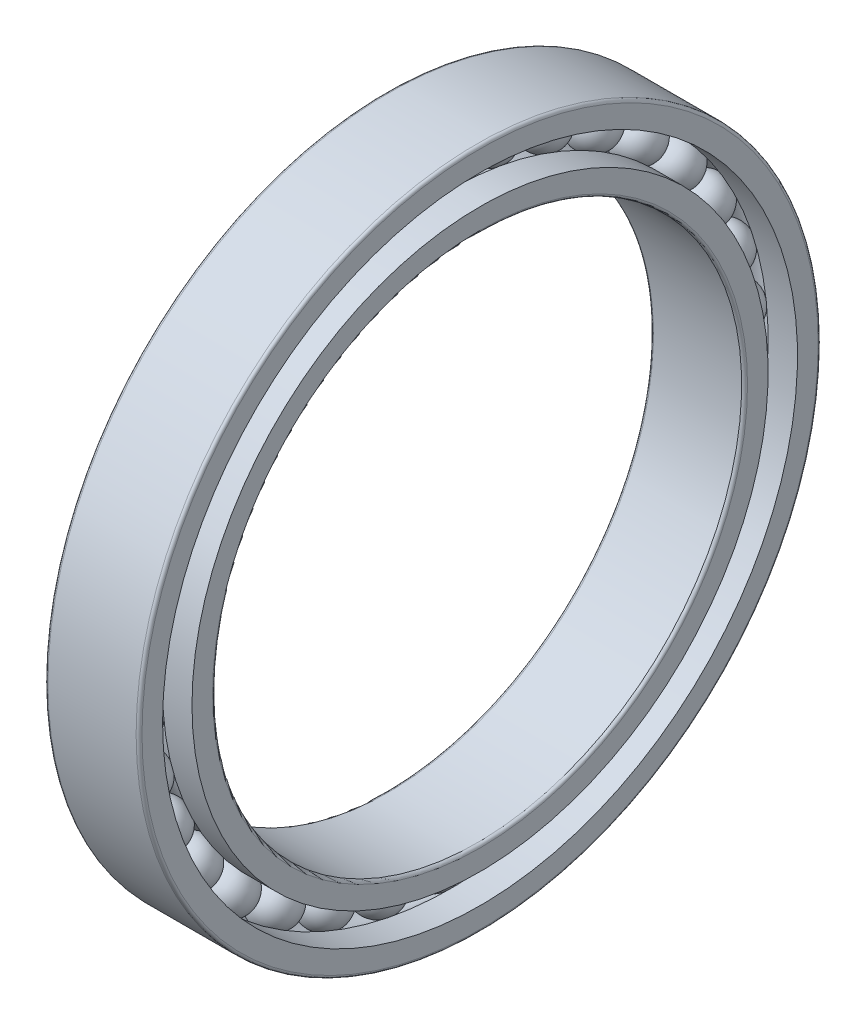
ISO-10303-21;
HEADER;
FILE_DESCRIPTION(('STEP AP214'),'2;1');
FILE_NAME('part.step','',(''),(''),'','','');
FILE_SCHEMA(('AUTOMOTIVE_DESIGN { 1 0 10303 214 1 1 1 1 }'));
ENDSEC;
DATA;
#1=APPLICATION_CONTEXT('core data for automotive mechanical design processes');
#2=APPLICATION_PROTOCOL_DEFINITION('international standard','automotive_design',2000,#1);
#3=PRODUCT_CONTEXT('',#1,'mechanical');
#4=PRODUCT('Part','Part','',(#3));
#5=PRODUCT_RELATED_PRODUCT_CATEGORY('part','',(#4));
#6=PRODUCT_DEFINITION_FORMATION('','',#4);
#7=PRODUCT_DEFINITION_CONTEXT('part definition',#1,'design');
#8=PRODUCT_DEFINITION('design','',#6,#7);
#9=PRODUCT_DEFINITION_SHAPE('','',#8);
#10=(LENGTH_UNIT() NAMED_UNIT(*) SI_UNIT(.MILLI.,.METRE.));
#11=(NAMED_UNIT(*) PLANE_ANGLE_UNIT() SI_UNIT($,.RADIAN.));
#12=(NAMED_UNIT(*) SI_UNIT($,.STERADIAN.) SOLID_ANGLE_UNIT());
#13=UNCERTAINTY_MEASURE_WITH_UNIT(LENGTH_MEASURE(1.E-05),#10,'distance_accuracy_value','');
#14=(GEOMETRIC_REPRESENTATION_CONTEXT(3) GLOBAL_UNCERTAINTY_ASSIGNED_CONTEXT((#13)) GLOBAL_UNIT_ASSIGNED_CONTEXT((#10,
#11,#12)) REPRESENTATION_CONTEXT('',''));
#15=CARTESIAN_POINT('',(0.,0.,0.));
#16=DIRECTION('',(0.,0.,1.));
#17=DIRECTION('',(1.,0.,0.));
#18=AXIS2_PLACEMENT_3D('',#15,#16,#17);
#19=CARTESIAN_POINT('',(0.,25.3115573168605,4.73155008377634));
#20=DIRECTION('',(-1.,0.,0.));
#21=DIRECTION('',(0.,0.982973099683904,0.183749517816557));
#22=AXIS2_PLACEMENT_3D('',#19,#20,#21);
#23=SPHERICAL_SURFACE('',#22,1.95);
#24=CARTESIAN_POINT('',(-1.95,25.3115573168605,4.73155008377634));
#25=VERTEX_POINT('',#24);
#26=VERTEX_LOOP('',#25);
#27=FACE_BOUND('',#26,.T.);
#28=ADVANCED_FACE('F47',(#27),#23,.T.);
#29=CLOSED_SHELL('',(#28));
#30=MANIFOLD_SOLID_BREP('B2',#29);
#31=CARTESIAN_POINT('',(0.,24.0111599071623,9.30197290431887));
#32=DIRECTION('',(-1.,0.,0.));
#33=DIRECTION('',(0.,0.932472229404361,0.361241666187141));
#34=AXIS2_PLACEMENT_3D('',#31,#32,#33);
#35=SPHERICAL_SURFACE('',#34,1.95);
#36=CARTESIAN_POINT('',(-1.95,24.0111599071623,9.30197290431887));
#37=VERTEX_POINT('',#36);
#38=VERTEX_LOOP('',#37);
#39=FACE_BOUND('',#38,.T.);
#40=ADVANCED_FACE('F67',(#39),#35,.T.);
#41=CLOSED_SHELL('',(#40));
#42=MANIFOLD_SOLID_BREP('B6',#41);
#43=CARTESIAN_POINT('',(0.,21.8930912450377,13.5556281940916));
#44=DIRECTION('',(-1.,0.,0.));
#45=DIRECTION('',(0.,0.850217135729621,0.526432162877345));
#46=AXIS2_PLACEMENT_3D('',#43,#44,#45);
#47=SPHERICAL_SURFACE('',#46,1.95);
#48=CARTESIAN_POINT('',(-1.95,21.8930912450377,13.5556281940916));
#49=VERTEX_POINT('',#48);
#50=VERTEX_LOOP('',#49);
#51=FACE_BOUND('',#50,.T.);
#52=ADVANCED_FACE('F87',(#51),#47,.T.);
#53=CLOSED_SHELL('',(#52));
#54=MANIFOLD_SOLID_BREP('B43',#53);
#55=CARTESIAN_POINT('',(0.,19.0294796184322,17.3476628238986));
#56=DIRECTION('',(-1.,0.,0.));
#57=DIRECTION('',(0.,0.739008917220668,0.673695643646548));
#58=AXIS2_PLACEMENT_3D('',#55,#56,#57);
#59=SPHERICAL_SURFACE('',#58,1.95);
#60=CARTESIAN_POINT('',(-1.95,19.0294796184322,17.3476628238986));
#61=VERTEX_POINT('',#60);
#62=VERTEX_LOOP('',#61);
#63=FACE_BOUND('',#62,.T.);
#64=ADVANCED_FACE('F107',(#63),#59,.T.);
#65=CLOSED_SHELL('',(#64));
#66=MANIFOLD_SOLID_BREP('B63',#65);
#67=CARTESIAN_POINT('',(0.,15.5178418867661,20.548943602466));
#68=DIRECTION('',(-1.,0.,0.));
#69=DIRECTION('',(0.,0.602634636379266,0.798017227280232));
#70=AXIS2_PLACEMENT_3D('',#67,#68,#69);
#71=SPHERICAL_SURFACE('',#70,1.95);
#72=CARTESIAN_POINT('',(-1.95,15.5178418867661,20.548943602466));
#73=VERTEX_POINT('',#72);
#74=VERTEX_LOOP('',#73);
#75=FACE_BOUND('',#74,.T.);
#76=ADVANCED_FACE('F127',(#75),#71,.T.);
#77=CLOSED_SHELL('',(#76));
#78=MANIFOLD_SOLID_BREP('B83',#77);
#79=CARTESIAN_POINT('',(0.,11.4777626612461,23.0504547523927));
#80=DIRECTION('',(-1.,0.,0.));
#81=DIRECTION('',(0.,0.445738355776549,0.895163291355057));
#82=AXIS2_PLACEMENT_3D('',#79,#80,#81);
#83=SPHERICAL_SURFACE('',#82,1.95);
#84=CARTESIAN_POINT('',(-1.95,11.4777626612461,23.0504547523927));
#85=VERTEX_POINT('',#84);
#86=VERTEX_LOOP('',#85);
#87=FACE_BOUND('',#86,.T.);
#88=ADVANCED_FACE('F147',(#87),#83,.T.);
#89=CLOSED_SHELL('',(#88));
#90=MANIFOLD_SOLID_BREP('B103',#89);
#91=CARTESIAN_POINT('',(0.,7.04682199435642,24.7670103117));
#92=DIRECTION('',(-1.,0.,0.));
#93=DIRECTION('',(0.,0.273662990072094,0.961825643172816));
#94=AXIS2_PLACEMENT_3D('',#91,#92,#93);
#95=SPHERICAL_SURFACE('',#94,1.95);
#96=CARTESIAN_POINT('',(-1.95,7.04682199435642,24.7670103117));
#97=VERTEX_POINT('',#96);
#98=VERTEX_LOOP('',#97);
#99=FACE_BOUND('',#98,.T.);
#100=ADVANCED_FACE('F167',(#99),#95,.T.);
#101=CLOSED_SHELL('',(#100));
#102=MANIFOLD_SOLID_BREP('B123',#101);
#103=CARTESIAN_POINT('',(0.,2.37591025618031,25.6401550395971));
#104=DIRECTION('',(-1.,0.,0.));
#105=DIRECTION('',(0.,0.092268359463313,0.995734176295033));
#106=AXIS2_PLACEMENT_3D('',#103,#104,#105);
#107=SPHERICAL_SURFACE('',#106,1.95);
#108=CARTESIAN_POINT('',(-1.95,2.37591025618031,25.6401550395971));
#109=VERTEX_POINT('',#108);
#110=VERTEX_LOOP('',#109);
#111=FACE_BOUND('',#110,.T.);
#112=ADVANCED_FACE('F187',(#111),#107,.T.);
#113=CLOSED_SHELL('',(#112));
#114=MANIFOLD_SOLID_BREP('B143',#113);
#115=CARTESIAN_POINT('',(0.,-2.37591025617975,25.6401550395972));
#116=DIRECTION('',(-1.,0.,0.));
#117=DIRECTION('',(0.,-0.0922683594632913,0.995734176295036));
#118=AXIS2_PLACEMENT_3D('',#115,#116,#117);
#119=SPHERICAL_SURFACE('',#118,1.95);
#120=CARTESIAN_POINT('',(-1.95,-2.37591025617975,25.6401550395972));
#121=VERTEX_POINT('',#120);
#122=VERTEX_LOOP('',#121);
#123=FACE_BOUND('',#122,.T.);
#124=ADVANCED_FACE('F207',(#123),#119,.T.);
#125=CLOSED_SHELL('',(#124));
#126=MANIFOLD_SOLID_BREP('B163',#125);
#127=CARTESIAN_POINT('',(0.,-7.04682199435588,24.7670103117002));
#128=DIRECTION('',(-1.,0.,0.));
#129=DIRECTION('',(0.,-0.273662990072073,0.961825643172822));
#130=AXIS2_PLACEMENT_3D('',#127,#128,#129);
#131=SPHERICAL_SURFACE('',#130,1.95);
#132=CARTESIAN_POINT('',(-1.95,-7.04682199435588,24.7670103117002));
#133=VERTEX_POINT('',#132);
#134=VERTEX_LOOP('',#133);
#135=FACE_BOUND('',#134,.T.);
#136=ADVANCED_FACE('F227',(#135),#131,.T.);
#137=CLOSED_SHELL('',(#136));
#138=MANIFOLD_SOLID_BREP('B183',#137);
#139=CARTESIAN_POINT('',(0.,-11.4777626612456,23.050454752393));
#140=DIRECTION('',(-1.,0.,0.));
#141=DIRECTION('',(0.,-0.44573835577653,0.895163291355066));
#142=AXIS2_PLACEMENT_3D('',#139,#140,#141);
#143=SPHERICAL_SURFACE('',#142,1.95);
#144=CARTESIAN_POINT('',(-1.95,-11.4777626612456,23.050454752393));
#145=VERTEX_POINT('',#144);
#146=VERTEX_LOOP('',#145);
#147=FACE_BOUND('',#146,.T.);
#148=ADVANCED_FACE('F247',(#147),#143,.T.);
#149=CLOSED_SHELL('',(#148));
#150=MANIFOLD_SOLID_BREP('B203',#149);
#151=CARTESIAN_POINT('',(0.,-15.5178418867657,20.5489436024663));
#152=DIRECTION('',(-1.,0.,0.));
#153=DIRECTION('',(0.,-0.602634636379249,0.798017227280245));
#154=AXIS2_PLACEMENT_3D('',#151,#152,#153);
#155=SPHERICAL_SURFACE('',#154,1.95);
#156=CARTESIAN_POINT('',(-1.95,-15.5178418867657,20.5489436024663));
#157=VERTEX_POINT('',#156);
#158=VERTEX_LOOP('',#157);
#159=FACE_BOUND('',#158,.T.);
#160=ADVANCED_FACE('F267',(#159),#155,.T.);
#161=CLOSED_SHELL('',(#160));
#162=MANIFOLD_SOLID_BREP('B223',#161);
#163=CARTESIAN_POINT('',(0.,-19.0294796184318,17.347662823899));
#164=DIRECTION('',(-1.,0.,0.));
#165=DIRECTION('',(0.,-0.739008917220653,0.673695643646564));
#166=AXIS2_PLACEMENT_3D('',#163,#164,#165);
#167=SPHERICAL_SURFACE('',#166,1.95);
#168=CARTESIAN_POINT('',(-1.95,-19.0294796184318,17.347662823899));
#169=VERTEX_POINT('',#168);
#170=VERTEX_LOOP('',#169);
#171=FACE_BOUND('',#170,.T.);
#172=ADVANCED_FACE('F287',(#171),#167,.T.);
#173=CLOSED_SHELL('',(#172));
#174=MANIFOLD_SOLID_BREP('B243',#173);
#175=CARTESIAN_POINT('',(0.,-21.8930912450375,13.5556281940921));
#176=DIRECTION('',(-1.,0.,0.));
#177=DIRECTION('',(0.,-0.85021713572961,0.526432162877363));
#178=AXIS2_PLACEMENT_3D('',#175,#176,#177);
#179=SPHERICAL_SURFACE('',#178,1.95);
#180=CARTESIAN_POINT('',(-1.95,-21.8930912450375,13.5556281940921));
#181=VERTEX_POINT('',#180);
#182=VERTEX_LOOP('',#181);
#183=FACE_BOUND('',#182,.T.);
#184=ADVANCED_FACE('F307',(#183),#179,.T.);
#185=CLOSED_SHELL('',(#184));
#186=MANIFOLD_SOLID_BREP('B263',#185);
#187=CARTESIAN_POINT('',(0.,-24.0111599071621,9.30197290431937));
#188=DIRECTION('',(-1.,0.,0.));
#189=DIRECTION('',(0.,-0.932472229404353,0.36124166618716));
#190=AXIS2_PLACEMENT_3D('',#187,#188,#189);
#191=SPHERICAL_SURFACE('',#190,1.95);
#192=CARTESIAN_POINT('',(-1.95,-24.0111599071621,9.30197290431937));
#193=VERTEX_POINT('',#192);
#194=VERTEX_LOOP('',#193);
#195=FACE_BOUND('',#194,.T.);
#196=ADVANCED_FACE('F327',(#195),#191,.T.);
#197=CLOSED_SHELL('',(#196));
#198=MANIFOLD_SOLID_BREP('B283',#197);
#199=CARTESIAN_POINT('',(0.,-25.3115573168604,4.73155008377687));
#200=DIRECTION('',(-1.,0.,0.));
#201=DIRECTION('',(0.,-0.9829730996839,0.183749517816578));
#202=AXIS2_PLACEMENT_3D('',#199,#200,#201);
#203=SPHERICAL_SURFACE('',#202,1.95);
#204=CARTESIAN_POINT('',(-1.95,-25.3115573168604,4.73155008377687));
#205=VERTEX_POINT('',#204);
#206=VERTEX_LOOP('',#205);
#207=FACE_BOUND('',#206,.T.);
#208=ADVANCED_FACE('F347',(#207),#203,.T.);
#209=CLOSED_SHELL('',(#208));
#210=MANIFOLD_SOLID_BREP('B303',#209);
#211=CARTESIAN_POINT('',(0.,-25.75,0.));
#212=DIRECTION('',(-1.,0.,0.));
#213=DIRECTION('',(0.,-1.,0.));
#214=AXIS2_PLACEMENT_3D('',#211,#212,#213);
#215=SPHERICAL_SURFACE('',#214,1.95);
#216=CARTESIAN_POINT('',(-1.95,-25.75,0.));
#217=VERTEX_POINT('',#216);
#218=VERTEX_LOOP('',#217);
#219=FACE_BOUND('',#218,.T.);
#220=ADVANCED_FACE('F367',(#219),#215,.T.);
#221=CLOSED_SHELL('',(#220));
#222=MANIFOLD_SOLID_BREP('B323',#221);
#223=CARTESIAN_POINT('',(0.,-25.3115573168605,-4.73155008377652));
#224=DIRECTION('',(-1.,0.,0.));
#225=DIRECTION('',(0.,-0.982973099683903,-0.183749517816564));
#226=AXIS2_PLACEMENT_3D('',#223,#224,#225);
#227=SPHERICAL_SURFACE('',#226,1.95);
#228=CARTESIAN_POINT('',(-1.95,-25.3115573168605,-4.73155008377652));
#229=VERTEX_POINT('',#228);
#230=VERTEX_LOOP('',#229);
#231=FACE_BOUND('',#230,.T.);
#232=ADVANCED_FACE('F387',(#231),#227,.T.);
#233=CLOSED_SHELL('',(#232));
#234=MANIFOLD_SOLID_BREP('B343',#233);
#235=CARTESIAN_POINT('',(0.,-24.0111599071622,-9.30197290431904));
#236=DIRECTION('',(-1.,0.,0.));
#237=DIRECTION('',(0.,-0.932472229404358,-0.361241666187147));
#238=AXIS2_PLACEMENT_3D('',#235,#236,#237);
#239=SPHERICAL_SURFACE('',#238,1.95);
#240=CARTESIAN_POINT('',(-1.95,-24.0111599071622,-9.30197290431904));
#241=VERTEX_POINT('',#240);
#242=VERTEX_LOOP('',#241);
#243=FACE_BOUND('',#242,.T.);
#244=ADVANCED_FACE('F407',(#243),#239,.T.);
#245=CLOSED_SHELL('',(#244));
#246=MANIFOLD_SOLID_BREP('B363',#245);
#247=CARTESIAN_POINT('',(0.,-21.8930912450376,-13.5556281940918));
#248=DIRECTION('',(-1.,0.,0.));
#249=DIRECTION('',(0.,-0.850217135729617,-0.526432162877351));
#250=AXIS2_PLACEMENT_3D('',#247,#248,#249);
#251=SPHERICAL_SURFACE('',#250,1.95);
#252=CARTESIAN_POINT('',(-1.95,-21.8930912450376,-13.5556281940918));
#253=VERTEX_POINT('',#252);
#254=VERTEX_LOOP('',#253);
#255=FACE_BOUND('',#254,.T.);
#256=ADVANCED_FACE('F427',(#255),#251,.T.);
#257=CLOSED_SHELL('',(#256));
#258=MANIFOLD_SOLID_BREP('B383',#257);
#259=CARTESIAN_POINT('',(0.,-19.0294796184321,-17.3476628238987));
#260=DIRECTION('',(-1.,0.,0.));
#261=DIRECTION('',(0.,-0.739008917220663,-0.673695643646553));
#262=AXIS2_PLACEMENT_3D('',#259,#260,#261);
#263=SPHERICAL_SURFACE('',#262,1.95);
#264=CARTESIAN_POINT('',(-1.95,-19.0294796184321,-17.3476628238987));
#265=VERTEX_POINT('',#264);
#266=VERTEX_LOOP('',#265);
#267=FACE_BOUND('',#266,.T.);
#268=ADVANCED_FACE('F447',(#267),#263,.T.);
#269=CLOSED_SHELL('',(#268));
#270=MANIFOLD_SOLID_BREP('B403',#269);
#271=CARTESIAN_POINT('',(0.,-15.517841886766,-20.5489436024661));
#272=DIRECTION('',(-1.,0.,0.));
#273=DIRECTION('',(0.,-0.602634636379261,-0.798017227280236));
#274=AXIS2_PLACEMENT_3D('',#271,#272,#273);
#275=SPHERICAL_SURFACE('',#274,1.95);
#276=CARTESIAN_POINT('',(-1.95,-15.517841886766,-20.5489436024661));
#277=VERTEX_POINT('',#276);
#278=VERTEX_LOOP('',#277);
#279=FACE_BOUND('',#278,.T.);
#280=ADVANCED_FACE('F467',(#279),#275,.T.);
#281=CLOSED_SHELL('',(#280));
#282=MANIFOLD_SOLID_BREP('B423',#281);
#283=CARTESIAN_POINT('',(0.,-11.477762661246,-23.0504547523928));
#284=DIRECTION('',(-1.,0.,0.));
#285=DIRECTION('',(0.,-0.445738355776542,-0.895163291355061));
#286=AXIS2_PLACEMENT_3D('',#283,#284,#285);
#287=SPHERICAL_SURFACE('',#286,1.95);
#288=CARTESIAN_POINT('',(-1.95,-11.477762661246,-23.0504547523928));
#289=VERTEX_POINT('',#288);
#290=VERTEX_LOOP('',#289);
#291=FACE_BOUND('',#290,.T.);
#292=ADVANCED_FACE('F487',(#291),#287,.T.);
#293=CLOSED_SHELL('',(#292));
#294=MANIFOLD_SOLID_BREP('B443',#293);
#295=CARTESIAN_POINT('',(0.,-7.04682199435623,-24.7670103117001));
#296=DIRECTION('',(-1.,0.,0.));
#297=DIRECTION('',(0.,-0.273662990072087,-0.961825643172818));
#298=AXIS2_PLACEMENT_3D('',#295,#296,#297);
#299=SPHERICAL_SURFACE('',#298,1.95);
#300=CARTESIAN_POINT('',(-1.95,-7.04682199435623,-24.7670103117001));
#301=VERTEX_POINT('',#300);
#302=VERTEX_LOOP('',#301);
#303=FACE_BOUND('',#302,.T.);
#304=ADVANCED_FACE('F507',(#303),#299,.T.);
#305=CLOSED_SHELL('',(#304));
#306=MANIFOLD_SOLID_BREP('B463',#305);
#307=CARTESIAN_POINT('',(0.,-2.37591025618012,-25.6401550395971));
#308=DIRECTION('',(-1.,0.,0.));
#309=DIRECTION('',(0.,-0.0922683594633057,-0.995734176295034));
#310=AXIS2_PLACEMENT_3D('',#307,#308,#309);
#311=SPHERICAL_SURFACE('',#310,1.95);
#312=CARTESIAN_POINT('',(-1.95,-2.37591025618012,-25.6401550395971));
#313=VERTEX_POINT('',#312);
#314=VERTEX_LOOP('',#313);
#315=FACE_BOUND('',#314,.T.);
#316=ADVANCED_FACE('F527',(#315),#311,.T.);
#317=CLOSED_SHELL('',(#316));
#318=MANIFOLD_SOLID_BREP('B483',#317);
#319=CARTESIAN_POINT('',(0.,2.37591025617994,-25.6401550395972));
#320=DIRECTION('',(-1.,0.,0.));
#321=DIRECTION('',(0.,0.0922683594632987,-0.995734176295035));
#322=AXIS2_PLACEMENT_3D('',#319,#320,#321);
#323=SPHERICAL_SURFACE('',#322,1.95);
#324=CARTESIAN_POINT('',(-1.95,2.37591025617994,-25.6401550395972));
#325=VERTEX_POINT('',#324);
#326=VERTEX_LOOP('',#325);
#327=FACE_BOUND('',#326,.T.);
#328=ADVANCED_FACE('F547',(#327),#323,.T.);
#329=CLOSED_SHELL('',(#328));
#330=MANIFOLD_SOLID_BREP('B503',#329);
#331=CARTESIAN_POINT('',(0.,7.04682199435606,-24.7670103117001));
#332=DIRECTION('',(-1.,0.,0.));
#333=DIRECTION('',(0.,0.27366299007208,-0.96182564317282));
#334=AXIS2_PLACEMENT_3D('',#331,#332,#333);
#335=SPHERICAL_SURFACE('',#334,1.95);
#336=CARTESIAN_POINT('',(-1.95,7.04682199435606,-24.7670103117001));
#337=VERTEX_POINT('',#336);
#338=VERTEX_LOOP('',#337);
#339=FACE_BOUND('',#338,.T.);
#340=ADVANCED_FACE('F567',(#339),#335,.T.);
#341=CLOSED_SHELL('',(#340));
#342=MANIFOLD_SOLID_BREP('B523',#341);
#343=CARTESIAN_POINT('',(0.,11.4777626612458,-23.0504547523929));
#344=DIRECTION('',(-1.,0.,0.));
#345=DIRECTION('',(0.,0.445738355776536,-0.895163291355063));
#346=AXIS2_PLACEMENT_3D('',#343,#344,#345);
#347=SPHERICAL_SURFACE('',#346,1.95);
#348=CARTESIAN_POINT('',(-1.95,11.4777626612458,-23.0504547523929));
#349=VERTEX_POINT('',#348);
#350=VERTEX_LOOP('',#349);
#351=FACE_BOUND('',#350,.T.);
#352=ADVANCED_FACE('F587',(#351),#347,.T.);
#353=CLOSED_SHELL('',(#352));
#354=MANIFOLD_SOLID_BREP('B543',#353);
#355=CARTESIAN_POINT('',(0.,15.5178418867658,-20.5489436024662));
#356=DIRECTION('',(-1.,0.,0.));
#357=DIRECTION('',(0.,0.602634636379255,-0.798017227280241));
#358=AXIS2_PLACEMENT_3D('',#355,#356,#357);
#359=SPHERICAL_SURFACE('',#358,1.95);
#360=CARTESIAN_POINT('',(-1.95,15.5178418867658,-20.5489436024662));
#361=VERTEX_POINT('',#360);
#362=VERTEX_LOOP('',#361);
#363=FACE_BOUND('',#362,.T.);
#364=ADVANCED_FACE('F607',(#363),#359,.T.);
#365=CLOSED_SHELL('',(#364));
#366=MANIFOLD_SOLID_BREP('B563',#365);
#367=CARTESIAN_POINT('',(0.,19.0294796184319,-17.3476628238989));
#368=DIRECTION('',(-1.,0.,0.));
#369=DIRECTION('',(0.,0.739008917220658,-0.673695643646558));
#370=AXIS2_PLACEMENT_3D('',#367,#368,#369);
#371=SPHERICAL_SURFACE('',#370,1.95);
#372=CARTESIAN_POINT('',(-1.95,19.0294796184319,-17.3476628238989));
#373=VERTEX_POINT('',#372);
#374=VERTEX_LOOP('',#373);
#375=FACE_BOUND('',#374,.T.);
#376=ADVANCED_FACE('F627',(#375),#371,.T.);
#377=CLOSED_SHELL('',(#376));
#378=MANIFOLD_SOLID_BREP('B583',#377);
#379=CARTESIAN_POINT('',(0.,21.8930912450375,-13.5556281940919));
#380=DIRECTION('',(-1.,0.,0.));
#381=DIRECTION('',(0.,0.850217135729613,-0.526432162877357));
#382=AXIS2_PLACEMENT_3D('',#379,#380,#381);
#383=SPHERICAL_SURFACE('',#382,1.95);
#384=CARTESIAN_POINT('',(-1.95,21.8930912450375,-13.5556281940919));
#385=VERTEX_POINT('',#384);
#386=VERTEX_LOOP('',#385);
#387=FACE_BOUND('',#386,.T.);
#388=ADVANCED_FACE('F647',(#387),#383,.T.);
#389=CLOSED_SHELL('',(#388));
#390=MANIFOLD_SOLID_BREP('B603',#389);
#391=CARTESIAN_POINT('',(0.,24.0111599071622,-9.30197290431921));
#392=DIRECTION('',(-1.,0.,0.));
#393=DIRECTION('',(0.,0.932472229404355,-0.361241666187154));
#394=AXIS2_PLACEMENT_3D('',#391,#392,#393);
#395=SPHERICAL_SURFACE('',#394,1.95);
#396=CARTESIAN_POINT('',(-1.95,24.0111599071622,-9.30197290431921));
#397=VERTEX_POINT('',#396);
#398=VERTEX_LOOP('',#397);
#399=FACE_BOUND('',#398,.T.);
#400=ADVANCED_FACE('F667',(#399),#395,.T.);
#401=CLOSED_SHELL('',(#400));
#402=MANIFOLD_SOLID_BREP('B623',#401);
#403=CARTESIAN_POINT('',(0.,25.3115573168605,-4.7315500837767));
#404=DIRECTION('',(-1.,0.,0.));
#405=DIRECTION('',(0.,0.982973099683902,-0.183749517816571));
#406=AXIS2_PLACEMENT_3D('',#403,#404,#405);
#407=SPHERICAL_SURFACE('',#406,1.95);
#408=CARTESIAN_POINT('',(-1.95,25.3115573168605,-4.7315500837767));
#409=VERTEX_POINT('',#408);
#410=VERTEX_LOOP('',#409);
#411=FACE_BOUND('',#410,.T.);
#412=ADVANCED_FACE('F687',(#411),#407,.T.);
#413=CLOSED_SHELL('',(#412));
#414=MANIFOLD_SOLID_BREP('B643',#413);
#415=CARTESIAN_POINT('',(0.,25.75,0.));
#416=DIRECTION('',(-1.,0.,0.));
#417=DIRECTION('',(0.,1.,0.));
#418=AXIS2_PLACEMENT_3D('',#415,#416,#417);
#419=SPHERICAL_SURFACE('',#418,1.95);
#420=CARTESIAN_POINT('',(-1.95,25.75,0.));
#421=VERTEX_POINT('',#420);
#422=VERTEX_LOOP('',#421);
#423=FACE_BOUND('',#422,.T.);
#424=ADVANCED_FACE('F709',(#423),#419,.T.);
#425=CLOSED_SHELL('',(#424));
#426=MANIFOLD_SOLID_BREP('B663',#425);
#427=CARTESIAN_POINT('',(-3.75,0.,0.));
#428=DIRECTION('',(-1.,0.,0.));
#429=DIRECTION('',(0.,0.,1.));
#430=AXIS2_PLACEMENT_3D('',#427,#428,#429);
#431=TOROIDAL_SURFACE('',#430,22.75,0.25);
#432=CARTESIAN_POINT('',(-3.75,0.,0.));
#433=DIRECTION('',(-1.,0.,0.));
#434=DIRECTION('',(0.,0.,1.));
#435=AXIS2_PLACEMENT_3D('',#432,#433,#434);
#436=CIRCLE('',#435,22.5);
#437=CARTESIAN_POINT('',(-3.75,0.,22.5));
#438=VERTEX_POINT('',#437);
#439=EDGE_CURVE('E758',#438,#438,#436,.T.);
#440=ORIENTED_EDGE('',*,*,#439,.F.);
#441=EDGE_LOOP('',(#440));
#442=FACE_BOUND('',#441,.T.);
#443=CARTESIAN_POINT('',(-4.,0.,0.));
#444=DIRECTION('',(-1.,0.,0.));
#445=DIRECTION('',(0.,0.,1.));
#446=AXIS2_PLACEMENT_3D('',#443,#444,#445);
#447=CIRCLE('',#446,22.75);
#448=CARTESIAN_POINT('',(-4.,0.,22.75));
#449=VERTEX_POINT('',#448);
#450=EDGE_CURVE('E708',#449,#449,#447,.T.);
#451=ORIENTED_EDGE('',*,*,#450,.T.);
#452=EDGE_LOOP('',(#451));
#453=FACE_BOUND('',#452,.T.);
#454=ADVANCED_FACE('F730',(#442,#453),#431,.T.);
#455=CARTESIAN_POINT('',(-4.,22.75,0.));
#456=DIRECTION('',(1.,0.,0.));
#457=DIRECTION('',(0.,0.,-1.));
#458=AXIS2_PLACEMENT_3D('',#455,#456,#457);
#459=PLANE('',#458);
#460=ORIENTED_EDGE('',*,*,#450,.F.);
#461=EDGE_LOOP('',(#460));
#462=FACE_BOUND('',#461,.T.);
#463=CARTESIAN_POINT('',(-4.,0.,0.));
#464=DIRECTION('',(-1.,0.,0.));
#465=DIRECTION('',(0.,0.,1.));
#466=AXIS2_PLACEMENT_3D('',#463,#464,#465);
#467=CIRCLE('',#466,24.5);
#468=CARTESIAN_POINT('',(-4.,0.,24.5));
#469=VERTEX_POINT('',#468);
#470=EDGE_CURVE('E736',#469,#469,#467,.T.);
#471=ORIENTED_EDGE('',*,*,#470,.T.);
#472=EDGE_LOOP('',(#471));
#473=FACE_BOUND('',#472,.T.);
#474=ADVANCED_FACE('F765',(#462,#473),#459,.F.);
#475=CARTESIAN_POINT('',(0.,0.,0.));
#476=DIRECTION('',(-1.,0.,0.));
#477=DIRECTION('',(0.,0.,1.));
#478=AXIS2_PLACEMENT_3D('',#475,#476,#477);
#479=CYLINDRICAL_SURFACE('',#478,24.5);
#480=ORIENTED_EDGE('',*,*,#470,.F.);
#481=EDGE_LOOP('',(#480));
#482=FACE_BOUND('',#481,.T.);
#483=CARTESIAN_POINT('',(-1.49666295470957,0.,0.));
#484=DIRECTION('',(-1.,0.,0.));
#485=DIRECTION('',(0.,0.,1.));
#486=AXIS2_PLACEMENT_3D('',#483,#484,#485);
#487=CIRCLE('',#486,24.5);
#488=CARTESIAN_POINT('',(-1.49666295470957,0.,24.5));
#489=VERTEX_POINT('',#488);
#490=EDGE_CURVE('E740',#489,#489,#487,.T.);
#491=ORIENTED_EDGE('',*,*,#490,.T.);
#492=EDGE_LOOP('',(#491));
#493=FACE_BOUND('',#492,.T.);
#494=ADVANCED_FACE('F769',(#482,#493),#479,.T.);
#495=CARTESIAN_POINT('',(0.,0.,0.));
#496=DIRECTION('',(-1.,0.,0.));
#497=DIRECTION('',(0.,0.,1.));
#498=AXIS2_PLACEMENT_3D('',#495,#496,#497);
#499=TOROIDAL_SURFACE('',#498,25.75,1.95);
#500=ORIENTED_EDGE('',*,*,#490,.F.);
#501=EDGE_LOOP('',(#500));
#502=FACE_BOUND('',#501,.T.);
#503=CARTESIAN_POINT('',(1.49666295470957,0.,0.));
#504=DIRECTION('',(-1.,0.,0.));
#505=DIRECTION('',(0.,0.,1.));
#506=AXIS2_PLACEMENT_3D('',#503,#504,#505);
#507=CIRCLE('',#506,24.5);
#508=CARTESIAN_POINT('',(1.49666295470957,0.,24.5));
#509=VERTEX_POINT('',#508);
#510=EDGE_CURVE('E744',#509,#509,#507,.T.);
#511=ORIENTED_EDGE('',*,*,#510,.T.);
#512=EDGE_LOOP('',(#511));
#513=FACE_BOUND('',#512,.T.);
#514=ADVANCED_FACE('F775',(#502,#513),#499,.F.);
#515=CARTESIAN_POINT('',(0.,0.,0.));
#516=DIRECTION('',(-1.,0.,0.));
#517=DIRECTION('',(0.,0.,1.));
#518=AXIS2_PLACEMENT_3D('',#515,#516,#517);
#519=CYLINDRICAL_SURFACE('',#518,24.5);
#520=ORIENTED_EDGE('',*,*,#510,.F.);
#521=EDGE_LOOP('',(#520));
#522=FACE_BOUND('',#521,.T.);
#523=CARTESIAN_POINT('',(4.,0.,0.));
#524=DIRECTION('',(-1.,0.,0.));
#525=DIRECTION('',(0.,0.,1.));
#526=AXIS2_PLACEMENT_3D('',#523,#524,#525);
#527=CIRCLE('',#526,24.5);
#528=CARTESIAN_POINT('',(4.,0.,24.5));
#529=VERTEX_POINT('',#528);
#530=EDGE_CURVE('E749',#529,#529,#527,.T.);
#531=ORIENTED_EDGE('',*,*,#530,.T.);
#532=EDGE_LOOP('',(#531));
#533=FACE_BOUND('',#532,.T.);
#534=ADVANCED_FACE('F781',(#522,#533),#519,.T.);
#535=CARTESIAN_POINT('',(4.,24.5,0.));
#536=DIRECTION('',(-1.,0.,0.));
#537=DIRECTION('',(0.,0.,1.));
#538=AXIS2_PLACEMENT_3D('',#535,#536,#537);
#539=PLANE('',#538);
#540=ORIENTED_EDGE('',*,*,#530,.F.);
#541=EDGE_LOOP('',(#540));
#542=FACE_BOUND('',#541,.T.);
#543=CARTESIAN_POINT('',(4.,0.,0.));
#544=DIRECTION('',(-1.,0.,0.));
#545=DIRECTION('',(0.,0.,1.));
#546=AXIS2_PLACEMENT_3D('',#543,#544,#545);
#547=CIRCLE('',#546,22.75);
#548=CARTESIAN_POINT('',(4.,0.,22.75));
#549=VERTEX_POINT('',#548);
#550=EDGE_CURVE('E752',#549,#549,#547,.T.);
#551=ORIENTED_EDGE('',*,*,#550,.T.);
#552=EDGE_LOOP('',(#551));
#553=FACE_BOUND('',#552,.T.);
#554=ADVANCED_FACE('F785',(#542,#553),#539,.F.);
#555=CARTESIAN_POINT('',(3.75,0.,0.));
#556=DIRECTION('',(-1.,0.,0.));
#557=DIRECTION('',(0.,0.,1.));
#558=AXIS2_PLACEMENT_3D('',#555,#556,#557);
#559=TOROIDAL_SURFACE('',#558,22.75,0.25);
#560=ORIENTED_EDGE('',*,*,#550,.F.);
#561=EDGE_LOOP('',(#560));
#562=FACE_BOUND('',#561,.T.);
#563=CARTESIAN_POINT('',(3.75,0.,0.));
#564=DIRECTION('',(-1.,0.,0.));
#565=DIRECTION('',(0.,0.,1.));
#566=AXIS2_PLACEMENT_3D('',#563,#564,#565);
#567=CIRCLE('',#566,22.5);
#568=CARTESIAN_POINT('',(3.75,0.,22.5));
#569=VERTEX_POINT('',#568);
#570=EDGE_CURVE('E755',#569,#569,#567,.T.);
#571=ORIENTED_EDGE('',*,*,#570,.T.);
#572=EDGE_LOOP('',(#571));
#573=FACE_BOUND('',#572,.T.);
#574=ADVANCED_FACE('F789',(#562,#573),#559,.T.);
#575=CARTESIAN_POINT('',(0.,0.,0.));
#576=DIRECTION('',(-1.,0.,0.));
#577=DIRECTION('',(0.,0.,1.));
#578=AXIS2_PLACEMENT_3D('',#575,#576,#577);
#579=CYLINDRICAL_SURFACE('',#578,22.5);
#580=ORIENTED_EDGE('',*,*,#570,.F.);
#581=EDGE_LOOP('',(#580));
#582=FACE_BOUND('',#581,.T.);
#583=ORIENTED_EDGE('',*,*,#439,.T.);
#584=EDGE_LOOP('',(#583));
#585=FACE_BOUND('',#584,.T.);
#586=ADVANCED_FACE('F762',(#582,#585),#579,.F.);
#587=CLOSED_SHELL('',(#454,#474,#494,#514,#534,#554,#574,#586));
#588=MANIFOLD_SOLID_BREP('B683',#587);
#589=CARTESIAN_POINT('',(0.,0.,0.));
#590=DIRECTION('',(-1.,0.,0.));
#591=DIRECTION('',(0.,0.,1.));
#592=AXIS2_PLACEMENT_3D('',#589,#590,#591);
#593=CYLINDRICAL_SURFACE('',#592,27.);
#594=CARTESIAN_POINT('',(-1.49666295470957,0.,0.));
#595=DIRECTION('',(-1.,0.,0.));
#596=DIRECTION('',(0.,0.,1.));
#597=AXIS2_PLACEMENT_3D('',#594,#595,#596);
#598=CIRCLE('',#597,27.);
#599=CARTESIAN_POINT('',(-1.49666295470957,0.,27.));
#600=VERTEX_POINT('',#599);
#601=EDGE_CURVE('E895',#600,#600,#598,.T.);
#602=ORIENTED_EDGE('',*,*,#601,.F.);
#603=EDGE_LOOP('',(#602));
#604=FACE_BOUND('',#603,.T.);
#605=CARTESIAN_POINT('',(-4.,0.,0.));
#606=DIRECTION('',(-1.,0.,0.));
#607=DIRECTION('',(0.,0.,1.));
#608=AXIS2_PLACEMENT_3D('',#605,#606,#607);
#609=CIRCLE('',#608,27.);
#610=CARTESIAN_POINT('',(-4.,0.,27.));
#611=VERTEX_POINT('',#610);
#612=EDGE_CURVE('E729',#611,#611,#609,.T.);
#613=ORIENTED_EDGE('',*,*,#612,.T.);
#614=EDGE_LOOP('',(#613));
#615=FACE_BOUND('',#614,.T.);
#616=ADVANCED_FACE('F867',(#604,#615),#593,.F.);
#617=CARTESIAN_POINT('',(-4.,28.75,0.));
#618=DIRECTION('',(1.,0.,0.));
#619=DIRECTION('',(0.,0.,-1.));
#620=AXIS2_PLACEMENT_3D('',#617,#618,#619);
#621=PLANE('',#620);
#622=ORIENTED_EDGE('',*,*,#612,.F.);
#623=EDGE_LOOP('',(#622));
#624=FACE_BOUND('',#623,.T.);
#625=CARTESIAN_POINT('',(-4.,0.,0.));
#626=DIRECTION('',(-1.,0.,0.));
#627=DIRECTION('',(0.,0.,1.));
#628=AXIS2_PLACEMENT_3D('',#625,#626,#627);
#629=CIRCLE('',#628,28.75);
#630=CARTESIAN_POINT('',(-4.,0.,28.75));
#631=VERTEX_POINT('',#630);
#632=EDGE_CURVE('E873',#631,#631,#629,.T.);
#633=ORIENTED_EDGE('',*,*,#632,.T.);
#634=EDGE_LOOP('',(#633));
#635=FACE_BOUND('',#634,.T.);
#636=ADVANCED_FACE('F902',(#624,#635),#621,.F.);
#637=CARTESIAN_POINT('',(-3.75,0.,0.));
#638=DIRECTION('',(-1.,0.,0.));
#639=DIRECTION('',(0.,0.,1.));
#640=AXIS2_PLACEMENT_3D('',#637,#638,#639);
#641=TOROIDAL_SURFACE('',#640,28.75,0.25);
#642=ORIENTED_EDGE('',*,*,#632,.F.);
#643=EDGE_LOOP('',(#642));
#644=FACE_BOUND('',#643,.T.);
#645=CARTESIAN_POINT('',(-3.75,0.,0.));
#646=DIRECTION('',(-1.,0.,0.));
#647=DIRECTION('',(0.,0.,1.));
#648=AXIS2_PLACEMENT_3D('',#645,#646,#647);
#649=CIRCLE('',#648,29.);
#650=CARTESIAN_POINT('',(-3.75,0.,29.));
#651=VERTEX_POINT('',#650);
#652=EDGE_CURVE('E877',#651,#651,#649,.T.);
#653=ORIENTED_EDGE('',*,*,#652,.T.);
#654=EDGE_LOOP('',(#653));
#655=FACE_BOUND('',#654,.T.);
#656=ADVANCED_FACE('F908',(#644,#655),#641,.T.);
#657=CARTESIAN_POINT('',(0.,0.,0.));
#658=DIRECTION('',(-1.,0.,0.));
#659=DIRECTION('',(0.,0.,1.));
#660=AXIS2_PLACEMENT_3D('',#657,#658,#659);
#661=CYLINDRICAL_SURFACE('',#660,29.);
#662=ORIENTED_EDGE('',*,*,#652,.F.);
#663=EDGE_LOOP('',(#662));
#664=FACE_BOUND('',#663,.T.);
#665=CARTESIAN_POINT('',(3.75,0.,0.));
#666=DIRECTION('',(-1.,0.,0.));
#667=DIRECTION('',(0.,0.,1.));
#668=AXIS2_PLACEMENT_3D('',#665,#666,#667);
#669=CIRCLE('',#668,29.);
#670=CARTESIAN_POINT('',(3.75,0.,29.));
#671=VERTEX_POINT('',#670);
#672=EDGE_CURVE('E881',#671,#671,#669,.T.);
#673=ORIENTED_EDGE('',*,*,#672,.T.);
#674=EDGE_LOOP('',(#673));
#675=FACE_BOUND('',#674,.T.);
#676=ADVANCED_FACE('F913',(#664,#675),#661,.T.);
#677=CARTESIAN_POINT('',(3.75,0.,0.));
#678=DIRECTION('',(-1.,0.,0.));
#679=DIRECTION('',(0.,0.,1.));
#680=AXIS2_PLACEMENT_3D('',#677,#678,#679);
#681=TOROIDAL_SURFACE('',#680,28.75,0.25);
#682=ORIENTED_EDGE('',*,*,#672,.F.);
#683=EDGE_LOOP('',(#682));
#684=FACE_BOUND('',#683,.T.);
#685=CARTESIAN_POINT('',(4.,0.,0.));
#686=DIRECTION('',(-1.,0.,0.));
#687=DIRECTION('',(0.,0.,1.));
#688=AXIS2_PLACEMENT_3D('',#685,#686,#687);
#689=CIRCLE('',#688,28.75);
#690=CARTESIAN_POINT('',(4.,0.,28.75));
#691=VERTEX_POINT('',#690);
#692=EDGE_CURVE('E886',#691,#691,#689,.T.);
#693=ORIENTED_EDGE('',*,*,#692,.T.);
#694=EDGE_LOOP('',(#693));
#695=FACE_BOUND('',#694,.T.);
#696=ADVANCED_FACE('F919',(#684,#695),#681,.T.);
#697=CARTESIAN_POINT('',(4.,27.,0.));
#698=DIRECTION('',(-1.,0.,0.));
#699=DIRECTION('',(0.,0.,1.));
#700=AXIS2_PLACEMENT_3D('',#697,#698,#699);
#701=PLANE('',#700);
#702=ORIENTED_EDGE('',*,*,#692,.F.);
#703=EDGE_LOOP('',(#702));
#704=FACE_BOUND('',#703,.T.);
#705=CARTESIAN_POINT('',(4.,0.,0.));
#706=DIRECTION('',(-1.,0.,0.));
#707=DIRECTION('',(0.,0.,1.));
#708=AXIS2_PLACEMENT_3D('',#705,#706,#707);
#709=CIRCLE('',#708,27.);
#710=CARTESIAN_POINT('',(4.,0.,27.));
#711=VERTEX_POINT('',#710);
#712=EDGE_CURVE('E889',#711,#711,#709,.T.);
#713=ORIENTED_EDGE('',*,*,#712,.T.);
#714=EDGE_LOOP('',(#713));
#715=FACE_BOUND('',#714,.T.);
#716=ADVANCED_FACE('F923',(#704,#715),#701,.F.);
#717=CARTESIAN_POINT('',(0.,0.,0.));
#718=DIRECTION('',(-1.,0.,0.));
#719=DIRECTION('',(0.,0.,1.));
#720=AXIS2_PLACEMENT_3D('',#717,#718,#719);
#721=CYLINDRICAL_SURFACE('',#720,27.);
#722=ORIENTED_EDGE('',*,*,#712,.F.);
#723=EDGE_LOOP('',(#722));
#724=FACE_BOUND('',#723,.T.);
#725=CARTESIAN_POINT('',(1.49666295470957,0.,0.));
#726=DIRECTION('',(-1.,0.,0.));
#727=DIRECTION('',(0.,0.,1.));
#728=AXIS2_PLACEMENT_3D('',#725,#726,#727);
#729=CIRCLE('',#728,27.);
#730=CARTESIAN_POINT('',(1.49666295470957,0.,27.));
#731=VERTEX_POINT('',#730);
#732=EDGE_CURVE('E892',#731,#731,#729,.T.);
#733=ORIENTED_EDGE('',*,*,#732,.T.);
#734=EDGE_LOOP('',(#733));
#735=FACE_BOUND('',#734,.T.);
#736=ADVANCED_FACE('F927',(#724,#735),#721,.F.);
#737=CARTESIAN_POINT('',(0.,0.,0.));
#738=DIRECTION('',(-1.,0.,0.));
#739=DIRECTION('',(0.,0.,1.));
#740=AXIS2_PLACEMENT_3D('',#737,#738,#739);
#741=TOROIDAL_SURFACE('',#740,25.75,1.95);
#742=ORIENTED_EDGE('',*,*,#732,.F.);
#743=EDGE_LOOP('',(#742));
#744=FACE_BOUND('',#743,.T.);
#745=ORIENTED_EDGE('',*,*,#601,.T.);
#746=EDGE_LOOP('',(#745));
#747=FACE_BOUND('',#746,.T.);
#748=ADVANCED_FACE('F899',(#744,#747),#741,.F.);
#749=CLOSED_SHELL('',(#616,#636,#656,#676,#696,#716,#736,#748));
#750=MANIFOLD_SOLID_BREP('B703',#749);
#751=ADVANCED_BREP_SHAPE_REPRESENTATION('',(#18,#30,#42,#54,#66,#78,#90,#102,#114,#126,#138,
#150,#162,#174,#186,#198,#210,#222,#234,#246,#258,#270,#282,#294,#306,#318,#330,#342,#354,#366,
#378,#390,#402,#414,#426,#588,#750),#14);
#752=SHAPE_DEFINITION_REPRESENTATION(#9,#751);
ENDSEC;
END-ISO-10303-21;
